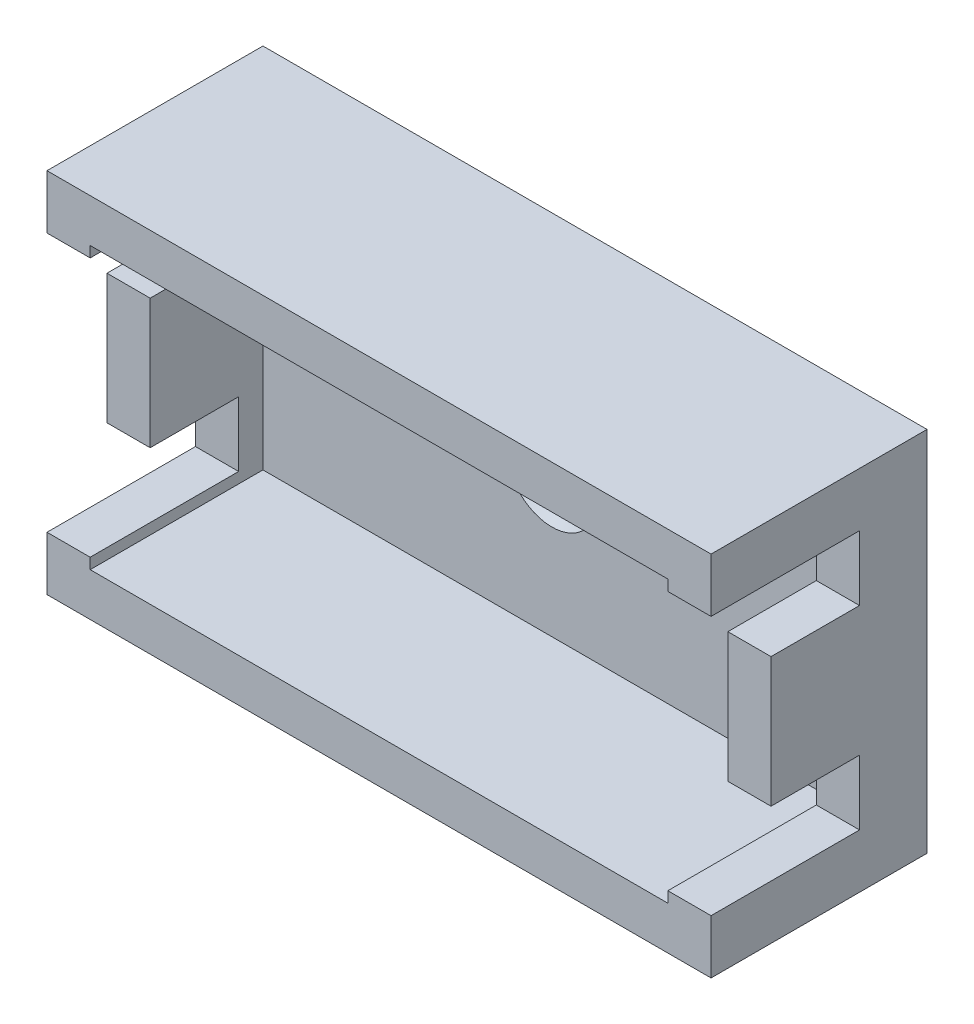
ISO-10303-21;
HEADER;
FILE_DESCRIPTION(('STEP AP214'),'2;1');
FILE_NAME('part.step','',(''),(''),'','','');
FILE_SCHEMA(('AUTOMOTIVE_DESIGN { 1 0 10303 214 1 1 1 1 }'));
ENDSEC;
DATA;
#1=APPLICATION_CONTEXT('core data for automotive mechanical design processes');
#2=APPLICATION_PROTOCOL_DEFINITION('international standard','automotive_design',2000,#1);
#3=PRODUCT_CONTEXT('',#1,'mechanical');
#4=PRODUCT('Part','Part','',(#3));
#5=PRODUCT_RELATED_PRODUCT_CATEGORY('part','',(#4));
#6=PRODUCT_DEFINITION_FORMATION('','',#4);
#7=PRODUCT_DEFINITION_CONTEXT('part definition',#1,'design');
#8=PRODUCT_DEFINITION('design','',#6,#7);
#9=PRODUCT_DEFINITION_SHAPE('','',#8);
#10=(LENGTH_UNIT() NAMED_UNIT(*) SI_UNIT(.MILLI.,.METRE.));
#11=(NAMED_UNIT(*) PLANE_ANGLE_UNIT() SI_UNIT($,.RADIAN.));
#12=(NAMED_UNIT(*) SI_UNIT($,.STERADIAN.) SOLID_ANGLE_UNIT());
#13=UNCERTAINTY_MEASURE_WITH_UNIT(LENGTH_MEASURE(1.E-05),#10,'distance_accuracy_value','');
#14=(GEOMETRIC_REPRESENTATION_CONTEXT(3) GLOBAL_UNCERTAINTY_ASSIGNED_CONTEXT((#13)) GLOBAL_UNIT_ASSIGNED_CONTEXT((#10,
#11,#12)) REPRESENTATION_CONTEXT('',''));
#15=CARTESIAN_POINT('',(0.,0.,0.));
#16=DIRECTION('',(0.,0.,1.));
#17=DIRECTION('',(1.,0.,0.));
#18=AXIS2_PLACEMENT_3D('',#15,#16,#17);
#19=CARTESIAN_POINT('',(0.,0.,20.));
#20=DIRECTION('',(0.,0.,1.));
#21=DIRECTION('',(1.,0.,0.));
#22=AXIS2_PLACEMENT_3D('',#19,#20,#21);
#23=PLANE('',#22);
#24=DIRECTION('',(0.,1.,0.));
#25=VECTOR('',#24,1.);
#26=CARTESIAN_POINT('',(4.,0.,20.));
#27=LINE('',#26,#25);
#28=CARTESIAN_POINT('',(4.,25.,20.));
#29=VERTEX_POINT('',#28);
#30=CARTESIAN_POINT('',(4.,30.,20.));
#31=VERTEX_POINT('',#30);
#32=EDGE_CURVE('E362',#29,#31,#27,.T.);
#33=ORIENTED_EDGE('',*,*,#32,.T.);
#34=DIRECTION('',(-1.,0.,0.));
#35=VECTOR('',#34,1.);
#36=CARTESIAN_POINT('',(0.,30.,20.));
#37=LINE('',#36,#35);
#38=CARTESIAN_POINT('',(-57.5,30.,20.));
#39=VERTEX_POINT('',#38);
#40=EDGE_CURVE('E224',#31,#39,#37,.T.);
#41=ORIENTED_EDGE('',*,*,#40,.T.);
#42=DIRECTION('',(0.,-1.,0.));
#43=VECTOR('',#42,1.);
#44=CARTESIAN_POINT('',(-57.5,0.,20.));
#45=LINE('',#44,#43);
#46=CARTESIAN_POINT('',(-57.5,25.,20.));
#47=VERTEX_POINT('',#46);
#48=EDGE_CURVE('E218',#39,#47,#45,.T.);
#49=ORIENTED_EDGE('',*,*,#48,.T.);
#50=DIRECTION('',(1.,0.,0.));
#51=VECTOR('',#50,1.);
#52=CARTESIAN_POINT('',(-57.5,25.,20.));
#53=LINE('',#52,#51);
#54=CARTESIAN_POINT('',(-53.5,25.,20.));
#55=VERTEX_POINT('',#54);
#56=EDGE_CURVE('E221',#47,#55,#53,.T.);
#57=ORIENTED_EDGE('',*,*,#56,.T.);
#58=DIRECTION('',(0.,-1.,0.));
#59=VECTOR('',#58,1.);
#60=CARTESIAN_POINT('',(-53.5,0.,20.));
#61=LINE('',#60,#59);
#62=CARTESIAN_POINT('',(-53.5,26.,20.));
#63=VERTEX_POINT('',#62);
#64=EDGE_CURVE('E344',#63,#55,#61,.T.);
#65=ORIENTED_EDGE('',*,*,#64,.F.);
#66=DIRECTION('',(-1.,0.,0.));
#67=VECTOR('',#66,1.);
#68=CARTESIAN_POINT('',(0.,26.,20.));
#69=LINE('',#68,#67);
#70=CARTESIAN_POINT('',(0.,26.,20.));
#71=VERTEX_POINT('',#70);
#72=EDGE_CURVE('E341',#71,#63,#69,.T.);
#73=ORIENTED_EDGE('',*,*,#72,.F.);
#74=DIRECTION('',(0.,1.,0.));
#75=VECTOR('',#74,1.);
#76=CARTESIAN_POINT('',(0.,0.,20.));
#77=LINE('',#76,#75);
#78=CARTESIAN_POINT('',(0.,25.,20.));
#79=VERTEX_POINT('',#78);
#80=EDGE_CURVE('E337',#79,#71,#77,.T.);
#81=ORIENTED_EDGE('',*,*,#80,.F.);
#82=EDGE_CURVE('E240',#79,#29,#53,.T.);
#83=ORIENTED_EDGE('',*,*,#82,.T.);
#84=EDGE_LOOP('',(#33,#41,#49,#57,#65,#73,#81,#83));
#85=FACE_BOUND('',#84,.T.);
#86=ADVANCED_FACE('F57',(#85),#23,.T.);
#87=CARTESIAN_POINT('',(4.,0.,20.));
#88=DIRECTION('',(-1.,0.,0.));
#89=DIRECTION('',(0.,0.,1.));
#90=AXIS2_PLACEMENT_3D('',#87,#88,#89);
#91=PLANE('',#90);
#92=DIRECTION('',(0.,0.,1.));
#93=VECTOR('',#92,1.);
#94=CARTESIAN_POINT('',(4.,25.,20.));
#95=LINE('',#94,#93);
#96=CARTESIAN_POINT('',(4.,25.,6.25023031285698));
#97=VERTEX_POINT('',#96);
#98=EDGE_CURVE('E320',#97,#29,#95,.T.);
#99=ORIENTED_EDGE('',*,*,#98,.F.);
#100=DIRECTION('',(0.,1.,0.));
#101=VECTOR('',#100,1.);
#102=CARTESIAN_POINT('',(4.,0.,6.25023031285698));
#103=LINE('',#102,#101);
#104=CARTESIAN_POINT('',(4.,19.,6.25023031285698));
#105=VERTEX_POINT('',#104);
#106=EDGE_CURVE('E315',#105,#97,#103,.T.);
#107=ORIENTED_EDGE('',*,*,#106,.F.);
#108=DIRECTION('',(0.,0.,-1.));
#109=VECTOR('',#108,1.);
#110=CARTESIAN_POINT('',(4.,19.,20.));
#111=LINE('',#110,#109);
#112=CARTESIAN_POINT('',(4.,19.,14.4456830158087));
#113=VERTEX_POINT('',#112);
#114=EDGE_CURVE('E310',#113,#105,#111,.T.);
#115=ORIENTED_EDGE('',*,*,#114,.F.);
#116=DIRECTION('',(0.,1.,0.));
#117=VECTOR('',#116,1.);
#118=CARTESIAN_POINT('',(4.,0.,14.4456830158087));
#119=LINE('',#118,#117);
#120=CARTESIAN_POINT('',(4.,6.99999999999998,14.4456830158087));
#121=VERTEX_POINT('',#120);
#122=EDGE_CURVE('E305',#121,#113,#119,.T.);
#123=ORIENTED_EDGE('',*,*,#122,.F.);
#124=DIRECTION('',(0.,0.,1.));
#125=VECTOR('',#124,1.);
#126=CARTESIAN_POINT('',(4.,6.99999999999998,20.));
#127=LINE('',#126,#125);
#128=CARTESIAN_POINT('',(4.,6.99999999999999,6.25023031285698));
#129=VERTEX_POINT('',#128);
#130=EDGE_CURVE('E300',#129,#121,#127,.T.);
#131=ORIENTED_EDGE('',*,*,#130,.F.);
#132=DIRECTION('',(0.,1.,0.));
#133=VECTOR('',#132,1.);
#134=CARTESIAN_POINT('',(4.,0.,6.25023031285698));
#135=LINE('',#134,#133);
#136=CARTESIAN_POINT('',(4.,0.999999999999987,6.25023031285698));
#137=VERTEX_POINT('',#136);
#138=EDGE_CURVE('E295',#137,#129,#135,.T.);
#139=ORIENTED_EDGE('',*,*,#138,.F.);
#140=DIRECTION('',(0.,0.,-1.));
#141=VECTOR('',#140,1.);
#142=CARTESIAN_POINT('',(4.,1.,20.));
#143=LINE('',#142,#141);
#144=CARTESIAN_POINT('',(4.,1.,20.));
#145=VERTEX_POINT('',#144);
#146=EDGE_CURVE('E249',#145,#137,#143,.T.);
#147=ORIENTED_EDGE('',*,*,#146,.F.);
#148=CARTESIAN_POINT('',(4.,-4.,20.));
#149=VERTEX_POINT('',#148);
#150=EDGE_CURVE('E360',#149,#145,#27,.T.);
#151=ORIENTED_EDGE('',*,*,#150,.F.);
#152=DIRECTION('',(0.,0.,-1.));
#153=VECTOR('',#152,1.);
#154=CARTESIAN_POINT('',(4.,-4.,20.));
#155=LINE('',#154,#153);
#156=CARTESIAN_POINT('',(4.,-4.,0.));
#157=VERTEX_POINT('',#156);
#158=EDGE_CURVE('E365',#149,#157,#155,.T.);
#159=ORIENTED_EDGE('',*,*,#158,.T.);
#160=DIRECTION('',(0.,1.,0.));
#161=VECTOR('',#160,1.);
#162=CARTESIAN_POINT('',(4.,0.,0.));
#163=LINE('',#162,#161);
#164=CARTESIAN_POINT('',(4.,30.,0.));
#165=VERTEX_POINT('',#164);
#166=EDGE_CURVE('E359',#157,#165,#163,.T.);
#167=ORIENTED_EDGE('',*,*,#166,.T.);
#168=DIRECTION('',(0.,0.,-1.));
#169=VECTOR('',#168,1.);
#170=CARTESIAN_POINT('',(4.,30.,20.));
#171=LINE('',#170,#169);
#172=EDGE_CURVE('E381',#31,#165,#171,.T.);
#173=ORIENTED_EDGE('',*,*,#172,.F.);
#174=ORIENTED_EDGE('',*,*,#32,.F.);
#175=EDGE_LOOP('',(#99,#107,#115,#123,#131,#139,#147,#151,#159,#167,#173,#174));
#176=FACE_BOUND('',#175,.T.);
#177=ADVANCED_FACE('F418',(#176),#91,.F.);
#178=CARTESIAN_POINT('',(-57.5,0.,20.));
#179=DIRECTION('',(1.,0.,0.));
#180=DIRECTION('',(0.,0.,-1.));
#181=AXIS2_PLACEMENT_3D('',#178,#179,#180);
#182=PLANE('',#181);
#183=DIRECTION('',(0.,0.,-1.));
#184=VECTOR('',#183,1.);
#185=CARTESIAN_POINT('',(-57.5,25.,20.));
#186=LINE('',#185,#184);
#187=CARTESIAN_POINT('',(-57.5,25.,6.25023031285698));
#188=VERTEX_POINT('',#187);
#189=EDGE_CURVE('E236',#47,#188,#186,.T.);
#190=ORIENTED_EDGE('',*,*,#189,.F.);
#191=ORIENTED_EDGE('',*,*,#48,.F.);
#192=DIRECTION('',(0.,0.,-1.));
#193=VECTOR('',#192,1.);
#194=CARTESIAN_POINT('',(-57.5,30.,20.));
#195=LINE('',#194,#193);
#196=CARTESIAN_POINT('',(-57.5,30.,0.));
#197=VERTEX_POINT('',#196);
#198=EDGE_CURVE('E379',#39,#197,#195,.T.);
#199=ORIENTED_EDGE('',*,*,#198,.T.);
#200=DIRECTION('',(0.,-1.,0.));
#201=VECTOR('',#200,1.);
#202=CARTESIAN_POINT('',(-57.5,0.,0.));
#203=LINE('',#202,#201);
#204=CARTESIAN_POINT('',(-57.5,-4.00000000000001,0.));
#205=VERTEX_POINT('',#204);
#206=EDGE_CURVE('E370',#197,#205,#203,.T.);
#207=ORIENTED_EDGE('',*,*,#206,.T.);
#208=DIRECTION('',(0.,0.,-1.));
#209=VECTOR('',#208,1.);
#210=CARTESIAN_POINT('',(-57.5,-4.00000000000001,20.));
#211=LINE('',#210,#209);
#212=CARTESIAN_POINT('',(-57.5,-4.00000000000001,20.));
#213=VERTEX_POINT('',#212);
#214=EDGE_CURVE('E376',#213,#205,#211,.T.);
#215=ORIENTED_EDGE('',*,*,#214,.F.);
#216=CARTESIAN_POINT('',(-57.5,1.,20.));
#217=VERTEX_POINT('',#216);
#218=EDGE_CURVE('E230',#217,#213,#45,.T.);
#219=ORIENTED_EDGE('',*,*,#218,.F.);
#220=DIRECTION('',(0.,0.,1.));
#221=VECTOR('',#220,1.);
#222=CARTESIAN_POINT('',(-57.5,1.,20.));
#223=LINE('',#222,#221);
#224=CARTESIAN_POINT('',(-57.5,0.999999999999987,6.25023031285698));
#225=VERTEX_POINT('',#224);
#226=EDGE_CURVE('E274',#225,#217,#223,.T.);
#227=ORIENTED_EDGE('',*,*,#226,.F.);
#228=DIRECTION('',(0.,-1.,0.));
#229=VECTOR('',#228,1.);
#230=CARTESIAN_POINT('',(-57.5,0.999999999999987,6.25023031285698));
#231=LINE('',#230,#229);
#232=CARTESIAN_POINT('',(-57.5,6.99999999999999,6.25023031285698));
#233=VERTEX_POINT('',#232);
#234=EDGE_CURVE('E269',#233,#225,#231,.T.);
#235=ORIENTED_EDGE('',*,*,#234,.F.);
#236=DIRECTION('',(0.,0.,-1.));
#237=VECTOR('',#236,1.);
#238=CARTESIAN_POINT('',(-57.5,6.99999999999998,14.4456830158087));
#239=LINE('',#238,#237);
#240=CARTESIAN_POINT('',(-57.5,6.99999999999998,14.4456830158087));
#241=VERTEX_POINT('',#240);
#242=EDGE_CURVE('E259',#241,#233,#239,.T.);
#243=ORIENTED_EDGE('',*,*,#242,.F.);
#244=DIRECTION('',(0.,-1.,0.));
#245=VECTOR('',#244,1.);
#246=CARTESIAN_POINT('',(-57.5,19.,14.4456830158087));
#247=LINE('',#246,#245);
#248=CARTESIAN_POINT('',(-57.5,19.,14.4456830158087));
#249=VERTEX_POINT('',#248);
#250=EDGE_CURVE('E254',#249,#241,#247,.T.);
#251=ORIENTED_EDGE('',*,*,#250,.F.);
#252=DIRECTION('',(0.,0.,1.));
#253=VECTOR('',#252,1.);
#254=CARTESIAN_POINT('',(-57.5,19.,14.4456830158087));
#255=LINE('',#254,#253);
#256=CARTESIAN_POINT('',(-57.5,19.,6.25023031285698));
#257=VERTEX_POINT('',#256);
#258=EDGE_CURVE('E264',#257,#249,#255,.T.);
#259=ORIENTED_EDGE('',*,*,#258,.F.);
#260=DIRECTION('',(0.,-1.,0.));
#261=VECTOR('',#260,1.);
#262=CARTESIAN_POINT('',(-57.5,25.,6.25023031285698));
#263=LINE('',#262,#261);
#264=EDGE_CURVE('E245',#188,#257,#263,.T.);
#265=ORIENTED_EDGE('',*,*,#264,.F.);
#266=EDGE_LOOP('',(#190,#191,#199,#207,#215,#219,#227,#235,#243,#251,#259,#265));
#267=FACE_BOUND('',#266,.T.);
#268=ADVANCED_FACE('F242',(#267),#182,.F.);
#269=CARTESIAN_POINT('',(0.,0.,20.));
#270=DIRECTION('',(-1.,0.,0.));
#271=DIRECTION('',(0.,0.,1.));
#272=AXIS2_PLACEMENT_3D('',#269,#270,#271);
#273=PLANE('',#272);
#274=DIRECTION('',(0.,1.,0.));
#275=VECTOR('',#274,1.);
#276=CARTESIAN_POINT('',(0.,0.,6.25023031285698));
#277=LINE('',#276,#275);
#278=CARTESIAN_POINT('',(0.,19.,6.25023031285698));
#279=VERTEX_POINT('',#278);
#280=CARTESIAN_POINT('',(0.,25.,6.25023031285698));
#281=VERTEX_POINT('',#280);
#282=EDGE_CURVE('E312',#279,#281,#277,.T.);
#283=ORIENTED_EDGE('',*,*,#282,.T.);
#284=DIRECTION('',(0.,0.,1.));
#285=VECTOR('',#284,1.);
#286=CARTESIAN_POINT('',(0.,25.,20.));
#287=LINE('',#286,#285);
#288=EDGE_CURVE('E317',#281,#79,#287,.T.);
#289=ORIENTED_EDGE('',*,*,#288,.T.);
#290=ORIENTED_EDGE('',*,*,#80,.T.);
#291=DIRECTION('',(0.,0.,-1.));
#292=VECTOR('',#291,1.);
#293=CARTESIAN_POINT('',(0.,26.,20.));
#294=LINE('',#293,#292);
#295=CARTESIAN_POINT('',(0.,26.,4.));
#296=VERTEX_POINT('',#295);
#297=EDGE_CURVE('E356',#71,#296,#294,.T.);
#298=ORIENTED_EDGE('',*,*,#297,.T.);
#299=DIRECTION('',(0.,1.,0.));
#300=VECTOR('',#299,1.);
#301=CARTESIAN_POINT('',(0.,0.,4.));
#302=LINE('',#301,#300);
#303=CARTESIAN_POINT('',(0.,0.,4.));
#304=VERTEX_POINT('',#303);
#305=EDGE_CURVE('E325',#304,#296,#302,.T.);
#306=ORIENTED_EDGE('',*,*,#305,.F.);
#307=DIRECTION('',(0.,0.,-1.));
#308=VECTOR('',#307,1.);
#309=CARTESIAN_POINT('',(0.,0.,20.));
#310=LINE('',#309,#308);
#311=CARTESIAN_POINT('',(0.,0.,20.));
#312=VERTEX_POINT('',#311);
#313=EDGE_CURVE('E348',#312,#304,#310,.T.);
#314=ORIENTED_EDGE('',*,*,#313,.F.);
#315=CARTESIAN_POINT('',(0.,1.,20.));
#316=VERTEX_POINT('',#315);
#317=EDGE_CURVE('E338',#312,#316,#77,.T.);
#318=ORIENTED_EDGE('',*,*,#317,.T.);
#319=DIRECTION('',(0.,0.,-1.));
#320=VECTOR('',#319,1.);
#321=CARTESIAN_POINT('',(0.,1.,20.));
#322=LINE('',#321,#320);
#323=CARTESIAN_POINT('',(0.,0.999999999999987,6.25023031285698));
#324=VERTEX_POINT('',#323);
#325=EDGE_CURVE('E246',#316,#324,#322,.T.);
#326=ORIENTED_EDGE('',*,*,#325,.T.);
#327=DIRECTION('',(0.,1.,0.));
#328=VECTOR('',#327,1.);
#329=CARTESIAN_POINT('',(0.,0.,6.25023031285698));
#330=LINE('',#329,#328);
#331=CARTESIAN_POINT('',(0.,6.99999999999999,6.25023031285698));
#332=VERTEX_POINT('',#331);
#333=EDGE_CURVE('E292',#324,#332,#330,.T.);
#334=ORIENTED_EDGE('',*,*,#333,.T.);
#335=DIRECTION('',(0.,0.,1.));
#336=VECTOR('',#335,1.);
#337=CARTESIAN_POINT('',(0.,6.99999999999998,20.));
#338=LINE('',#337,#336);
#339=CARTESIAN_POINT('',(0.,6.99999999999998,14.4456830158087));
#340=VERTEX_POINT('',#339);
#341=EDGE_CURVE('E297',#332,#340,#338,.T.);
#342=ORIENTED_EDGE('',*,*,#341,.T.);
#343=DIRECTION('',(0.,1.,0.));
#344=VECTOR('',#343,1.);
#345=CARTESIAN_POINT('',(0.,0.,14.4456830158087));
#346=LINE('',#345,#344);
#347=CARTESIAN_POINT('',(0.,19.,14.4456830158087));
#348=VERTEX_POINT('',#347);
#349=EDGE_CURVE('E302',#340,#348,#346,.T.);
#350=ORIENTED_EDGE('',*,*,#349,.T.);
#351=DIRECTION('',(0.,0.,-1.));
#352=VECTOR('',#351,1.);
#353=CARTESIAN_POINT('',(0.,19.,20.));
#354=LINE('',#353,#352);
#355=EDGE_CURVE('E307',#348,#279,#354,.T.);
#356=ORIENTED_EDGE('',*,*,#355,.T.);
#357=EDGE_LOOP('',(#283,#289,#290,#298,#306,#314,#318,#326,#334,#342,#350,#356));
#358=FACE_BOUND('',#357,.T.);
#359=ADVANCED_FACE('F437',(#358),#273,.T.);
#360=CARTESIAN_POINT('',(-53.5,0.,20.));
#361=DIRECTION('',(1.,0.,0.));
#362=DIRECTION('',(0.,0.,-1.));
#363=AXIS2_PLACEMENT_3D('',#360,#361,#362);
#364=PLANE('',#363);
#365=ORIENTED_EDGE('',*,*,#64,.T.);
#366=DIRECTION('',(0.,0.,-1.));
#367=VECTOR('',#366,1.);
#368=CARTESIAN_POINT('',(-53.5,25.,20.));
#369=LINE('',#368,#367);
#370=CARTESIAN_POINT('',(-53.5,25.,6.25023031285698));
#371=VERTEX_POINT('',#370);
#372=EDGE_CURVE('E239',#55,#371,#369,.T.);
#373=ORIENTED_EDGE('',*,*,#372,.T.);
#374=DIRECTION('',(0.,-1.,0.));
#375=VECTOR('',#374,1.);
#376=CARTESIAN_POINT('',(-53.5,0.,6.25023031285698));
#377=LINE('',#376,#375);
#378=CARTESIAN_POINT('',(-53.5,19.,6.25023031285698));
#379=VERTEX_POINT('',#378);
#380=EDGE_CURVE('E398',#371,#379,#377,.T.);
#381=ORIENTED_EDGE('',*,*,#380,.T.);
#382=DIRECTION('',(0.,0.,1.));
#383=VECTOR('',#382,1.);
#384=CARTESIAN_POINT('',(-53.5,19.,20.));
#385=LINE('',#384,#383);
#386=CARTESIAN_POINT('',(-53.5,19.,14.4456830158087));
#387=VERTEX_POINT('',#386);
#388=EDGE_CURVE('E395',#379,#387,#385,.T.);
#389=ORIENTED_EDGE('',*,*,#388,.T.);
#390=DIRECTION('',(0.,-1.,0.));
#391=VECTOR('',#390,1.);
#392=CARTESIAN_POINT('',(-53.5,0.,14.4456830158087));
#393=LINE('',#392,#391);
#394=CARTESIAN_POINT('',(-53.5,6.99999999999998,14.4456830158087));
#395=VERTEX_POINT('',#394);
#396=EDGE_CURVE('E392',#387,#395,#393,.T.);
#397=ORIENTED_EDGE('',*,*,#396,.T.);
#398=DIRECTION('',(0.,0.,-1.));
#399=VECTOR('',#398,1.);
#400=CARTESIAN_POINT('',(-53.5,6.99999999999998,20.));
#401=LINE('',#400,#399);
#402=CARTESIAN_POINT('',(-53.5,6.99999999999999,6.25023031285698));
#403=VERTEX_POINT('',#402);
#404=EDGE_CURVE('E389',#395,#403,#401,.T.);
#405=ORIENTED_EDGE('',*,*,#404,.T.);
#406=DIRECTION('',(0.,-1.,0.));
#407=VECTOR('',#406,1.);
#408=CARTESIAN_POINT('',(-53.5,0.,6.25023031285698));
#409=LINE('',#408,#407);
#410=CARTESIAN_POINT('',(-53.5,0.999999999999987,6.25023031285698));
#411=VERTEX_POINT('',#410);
#412=EDGE_CURVE('E386',#403,#411,#409,.T.);
#413=ORIENTED_EDGE('',*,*,#412,.T.);
#414=DIRECTION('',(0.,0.,1.));
#415=VECTOR('',#414,1.);
#416=CARTESIAN_POINT('',(-53.5,1.,20.));
#417=LINE('',#416,#415);
#418=CARTESIAN_POINT('',(-53.5,1.,20.));
#419=VERTEX_POINT('',#418);
#420=EDGE_CURVE('E384',#411,#419,#417,.T.);
#421=ORIENTED_EDGE('',*,*,#420,.T.);
#422=CARTESIAN_POINT('',(-53.5,0.,20.));
#423=VERTEX_POINT('',#422);
#424=EDGE_CURVE('E343',#419,#423,#61,.T.);
#425=ORIENTED_EDGE('',*,*,#424,.T.);
#426=DIRECTION('',(0.,0.,-1.));
#427=VECTOR('',#426,1.);
#428=CARTESIAN_POINT('',(-53.5,0.,20.));
#429=LINE('',#428,#427);
#430=CARTESIAN_POINT('',(-53.5,0.,4.));
#431=VERTEX_POINT('',#430);
#432=EDGE_CURVE('E350',#423,#431,#429,.T.);
#433=ORIENTED_EDGE('',*,*,#432,.T.);
#434=DIRECTION('',(0.,-1.,0.));
#435=VECTOR('',#434,1.);
#436=CARTESIAN_POINT('',(-53.5,0.,4.));
#437=LINE('',#436,#435);
#438=CARTESIAN_POINT('',(-53.5,26.,4.));
#439=VERTEX_POINT('',#438);
#440=EDGE_CURVE('E331',#439,#431,#437,.T.);
#441=ORIENTED_EDGE('',*,*,#440,.F.);
#442=DIRECTION('',(0.,0.,-1.));
#443=VECTOR('',#442,1.);
#444=CARTESIAN_POINT('',(-53.5,26.,20.));
#445=LINE('',#444,#443);
#446=EDGE_CURVE('E353',#63,#439,#445,.T.);
#447=ORIENTED_EDGE('',*,*,#446,.F.);
#448=EDGE_LOOP('',(#365,#373,#381,#389,#397,#405,#413,#421,#425,#433,#441,#447));
#449=FACE_BOUND('',#448,.T.);
#450=ADVANCED_FACE('F429',(#449),#364,.T.);
#451=ORIENTED_EDGE('',*,*,#150,.T.);
#452=DIRECTION('',(1.,0.,0.));
#453=VECTOR('',#452,1.);
#454=CARTESIAN_POINT('',(-57.5,1.,20.));
#455=LINE('',#454,#453);
#456=EDGE_CURVE('E279',#316,#145,#455,.T.);
#457=ORIENTED_EDGE('',*,*,#456,.F.);
#458=ORIENTED_EDGE('',*,*,#317,.F.);
#459=DIRECTION('',(1.,0.,0.));
#460=VECTOR('',#459,1.);
#461=CARTESIAN_POINT('',(0.,0.,20.));
#462=LINE('',#461,#460);
#463=EDGE_CURVE('E346',#423,#312,#462,.T.);
#464=ORIENTED_EDGE('',*,*,#463,.F.);
#465=ORIENTED_EDGE('',*,*,#424,.F.);
#466=EDGE_CURVE('E80',#217,#419,#455,.T.);
#467=ORIENTED_EDGE('',*,*,#466,.F.);
#468=ORIENTED_EDGE('',*,*,#218,.T.);
#469=DIRECTION('',(1.,0.,0.));
#470=VECTOR('',#469,1.);
#471=CARTESIAN_POINT('',(0.,-4.,20.));
#472=LINE('',#471,#470);
#473=EDGE_CURVE('E229',#213,#149,#472,.T.);
#474=ORIENTED_EDGE('',*,*,#473,.T.);
#475=EDGE_LOOP('',(#451,#457,#458,#464,#465,#467,#468,#474));
#476=FACE_BOUND('',#475,.T.);
#477=ADVANCED_FACE('F420',(#476),#23,.T.);
#478=CARTESIAN_POINT('',(0.,0.,0.));
#479=DIRECTION('',(0.,0.,1.));
#480=DIRECTION('',(1.,0.,0.));
#481=AXIS2_PLACEMENT_3D('',#478,#479,#480);
#482=PLANE('',#481);
#483=CARTESIAN_POINT('',(-26.75,13.,0.));
#484=DIRECTION('',(0.,0.,1.));
#485=DIRECTION('',(1.,0.,0.));
#486=AXIS2_PLACEMENT_3D('',#483,#484,#485);
#487=CIRCLE('',#486,2.00000000000001);
#488=CARTESIAN_POINT('',(-24.75,13.,0.));
#489=VERTEX_POINT('',#488);
#490=EDGE_CURVE('E322',#489,#489,#487,.T.);
#491=ORIENTED_EDGE('',*,*,#490,.T.);
#492=EDGE_LOOP('',(#491));
#493=FACE_BOUND('',#492,.T.);
#494=ORIENTED_EDGE('',*,*,#166,.F.);
#495=DIRECTION('',(1.,0.,0.));
#496=VECTOR('',#495,1.);
#497=CARTESIAN_POINT('',(0.,-4.,0.));
#498=LINE('',#497,#496);
#499=EDGE_CURVE('E372',#205,#157,#498,.T.);
#500=ORIENTED_EDGE('',*,*,#499,.F.);
#501=ORIENTED_EDGE('',*,*,#206,.F.);
#502=DIRECTION('',(-1.,0.,0.));
#503=VECTOR('',#502,1.);
#504=CARTESIAN_POINT('',(0.,30.,0.));
#505=LINE('',#504,#503);
#506=EDGE_CURVE('E368',#165,#197,#505,.T.);
#507=ORIENTED_EDGE('',*,*,#506,.F.);
#508=EDGE_LOOP('',(#494,#500,#501,#507));
#509=FACE_BOUND('',#508,.T.);
#510=ADVANCED_FACE('F428',(#493,#509),#482,.F.);
#511=CARTESIAN_POINT('',(0.,30.,20.));
#512=DIRECTION('',(0.,-1.,0.));
#513=DIRECTION('',(1.,0.,0.));
#514=AXIS2_PLACEMENT_3D('',#511,#512,#513);
#515=PLANE('',#514);
#516=ORIENTED_EDGE('',*,*,#506,.T.);
#517=ORIENTED_EDGE('',*,*,#198,.F.);
#518=ORIENTED_EDGE('',*,*,#40,.F.);
#519=ORIENTED_EDGE('',*,*,#172,.T.);
#520=EDGE_LOOP('',(#516,#517,#518,#519));
#521=FACE_BOUND('',#520,.T.);
#522=ADVANCED_FACE('F435',(#521),#515,.F.);
#523=CARTESIAN_POINT('',(0.,-4.,20.));
#524=DIRECTION('',(0.,1.,0.));
#525=DIRECTION('',(-1.,0.,0.));
#526=AXIS2_PLACEMENT_3D('',#523,#524,#525);
#527=PLANE('',#526);
#528=ORIENTED_EDGE('',*,*,#499,.T.);
#529=ORIENTED_EDGE('',*,*,#158,.F.);
#530=ORIENTED_EDGE('',*,*,#473,.F.);
#531=ORIENTED_EDGE('',*,*,#214,.T.);
#532=EDGE_LOOP('',(#528,#529,#530,#531));
#533=FACE_BOUND('',#532,.T.);
#534=ADVANCED_FACE('F495',(#533),#527,.F.);
#535=CARTESIAN_POINT('',(0.,26.,20.));
#536=DIRECTION('',(0.,-1.,0.));
#537=DIRECTION('',(1.,0.,0.));
#538=AXIS2_PLACEMENT_3D('',#535,#536,#537);
#539=PLANE('',#538);
#540=DIRECTION('',(-1.,0.,0.));
#541=VECTOR('',#540,1.);
#542=CARTESIAN_POINT('',(0.,26.,4.));
#543=LINE('',#542,#541);
#544=EDGE_CURVE('E328',#296,#439,#543,.T.);
#545=ORIENTED_EDGE('',*,*,#544,.F.);
#546=ORIENTED_EDGE('',*,*,#297,.F.);
#547=ORIENTED_EDGE('',*,*,#72,.T.);
#548=ORIENTED_EDGE('',*,*,#446,.T.);
#549=EDGE_LOOP('',(#545,#546,#547,#548));
#550=FACE_BOUND('',#549,.T.);
#551=ADVANCED_FACE('F471',(#550),#539,.T.);
#552=CARTESIAN_POINT('',(0.,0.,20.));
#553=DIRECTION('',(0.,1.,0.));
#554=DIRECTION('',(-1.,0.,0.));
#555=AXIS2_PLACEMENT_3D('',#552,#553,#554);
#556=PLANE('',#555);
#557=DIRECTION('',(1.,0.,0.));
#558=VECTOR('',#557,1.);
#559=CARTESIAN_POINT('',(0.,0.,4.));
#560=LINE('',#559,#558);
#561=EDGE_CURVE('E334',#431,#304,#560,.T.);
#562=ORIENTED_EDGE('',*,*,#561,.F.);
#563=ORIENTED_EDGE('',*,*,#432,.F.);
#564=ORIENTED_EDGE('',*,*,#463,.T.);
#565=ORIENTED_EDGE('',*,*,#313,.T.);
#566=EDGE_LOOP('',(#562,#563,#564,#565));
#567=FACE_BOUND('',#566,.T.);
#568=ADVANCED_FACE('F465',(#567),#556,.T.);
#569=CARTESIAN_POINT('',(0.,0.,4.));
#570=DIRECTION('',(0.,0.,1.));
#571=DIRECTION('',(1.,0.,0.));
#572=AXIS2_PLACEMENT_3D('',#569,#570,#571);
#573=PLANE('',#572);
#574=CARTESIAN_POINT('',(-26.75,13.,4.));
#575=DIRECTION('',(0.,0.,1.));
#576=DIRECTION('',(1.,0.,0.));
#577=AXIS2_PLACEMENT_3D('',#574,#575,#576);
#578=CIRCLE('',#577,4.20000000000002);
#579=CARTESIAN_POINT('',(-22.55,13.,4.));
#580=VERTEX_POINT('',#579);
#581=EDGE_CURVE('E12',#580,#580,#578,.F.);
#582=ORIENTED_EDGE('',*,*,#581,.T.);
#583=EDGE_LOOP('',(#582));
#584=FACE_BOUND('',#583,.T.);
#585=ORIENTED_EDGE('',*,*,#305,.T.);
#586=ORIENTED_EDGE('',*,*,#544,.T.);
#587=ORIENTED_EDGE('',*,*,#440,.T.);
#588=ORIENTED_EDGE('',*,*,#561,.T.);
#589=EDGE_LOOP('',(#585,#586,#587,#588));
#590=FACE_BOUND('',#589,.T.);
#591=ADVANCED_FACE('F468',(#584,#590),#573,.T.);
#592=CARTESIAN_POINT('',(-26.75,13.,0.));
#593=DIRECTION('',(0.,0.,1.));
#594=DIRECTION('',(1.,0.,0.));
#595=AXIS2_PLACEMENT_3D('',#592,#593,#594);
#596=CYLINDRICAL_SURFACE('',#595,2.00000000000001);
#597=CARTESIAN_POINT('',(-26.75,13.,1.79999999999999));
#598=DIRECTION('',(0.,0.,1.));
#599=DIRECTION('',(1.,0.,0.));
#600=AXIS2_PLACEMENT_3D('',#597,#598,#599);
#601=CIRCLE('',#600,2.00000000000001);
#602=CARTESIAN_POINT('',(-24.75,13.,1.79999999999999));
#603=VERTEX_POINT('',#602);
#604=EDGE_CURVE('E65',#603,#603,#601,.T.);
#605=ORIENTED_EDGE('',*,*,#604,.T.);
#606=EDGE_LOOP('',(#605));
#607=FACE_BOUND('',#606,.T.);
#608=ORIENTED_EDGE('',*,*,#490,.F.);
#609=EDGE_LOOP('',(#608));
#610=FACE_BOUND('',#609,.T.);
#611=ADVANCED_FACE('F404',(#607,#610),#596,.F.);
#612=CARTESIAN_POINT('',(-57.5,1.,20.));
#613=DIRECTION('',(0.,1.,0.));
#614=DIRECTION('',(0.,0.,1.));
#615=AXIS2_PLACEMENT_3D('',#612,#613,#614);
#616=PLANE('',#615);
#617=ORIENTED_EDGE('',*,*,#420,.F.);
#618=DIRECTION('',(1.,0.,0.));
#619=VECTOR('',#618,1.);
#620=CARTESIAN_POINT('',(-57.5,0.999999999999987,6.25023031285698));
#621=LINE('',#620,#619);
#622=EDGE_CURVE('E277',#225,#411,#621,.T.);
#623=ORIENTED_EDGE('',*,*,#622,.F.);
#624=ORIENTED_EDGE('',*,*,#226,.T.);
#625=ORIENTED_EDGE('',*,*,#466,.T.);
#626=EDGE_LOOP('',(#617,#623,#624,#625));
#627=FACE_BOUND('',#626,.T.);
#628=ADVANCED_FACE('F415',(#627),#616,.T.);
#629=CARTESIAN_POINT('',(-57.5,0.999999999999987,6.25023031285698));
#630=DIRECTION('',(0.,0.,1.));
#631=DIRECTION('',(0.,-1.,0.));
#632=AXIS2_PLACEMENT_3D('',#629,#630,#631);
#633=PLANE('',#632);
#634=ORIENTED_EDGE('',*,*,#412,.F.);
#635=DIRECTION('',(1.,0.,0.));
#636=VECTOR('',#635,1.);
#637=CARTESIAN_POINT('',(-57.5,6.99999999999999,6.25023031285698));
#638=LINE('',#637,#636);
#639=EDGE_CURVE('E273',#233,#403,#638,.T.);
#640=ORIENTED_EDGE('',*,*,#639,.F.);
#641=ORIENTED_EDGE('',*,*,#234,.T.);
#642=ORIENTED_EDGE('',*,*,#622,.T.);
#643=EDGE_LOOP('',(#634,#640,#641,#642));
#644=FACE_BOUND('',#643,.T.);
#645=ADVANCED_FACE('F488',(#644),#633,.T.);
#646=CARTESIAN_POINT('',(-57.5,6.99999999999998,14.4456830158087));
#647=DIRECTION('',(0.,-1.,0.));
#648=DIRECTION('',(0.,0.,-1.));
#649=AXIS2_PLACEMENT_3D('',#646,#647,#648);
#650=PLANE('',#649);
#651=ORIENTED_EDGE('',*,*,#404,.F.);
#652=DIRECTION('',(1.,0.,0.));
#653=VECTOR('',#652,1.);
#654=CARTESIAN_POINT('',(-57.5,6.99999999999998,14.4456830158087));
#655=LINE('',#654,#653);
#656=EDGE_CURVE('E263',#241,#395,#655,.T.);
#657=ORIENTED_EDGE('',*,*,#656,.F.);
#658=ORIENTED_EDGE('',*,*,#242,.T.);
#659=ORIENTED_EDGE('',*,*,#639,.T.);
#660=EDGE_LOOP('',(#651,#657,#658,#659));
#661=FACE_BOUND('',#660,.T.);
#662=ADVANCED_FACE('F485',(#661),#650,.T.);
#663=CARTESIAN_POINT('',(-57.5,19.,14.4456830158087));
#664=DIRECTION('',(0.,0.,1.));
#665=DIRECTION('',(0.,-1.,0.));
#666=AXIS2_PLACEMENT_3D('',#663,#664,#665);
#667=PLANE('',#666);
#668=ORIENTED_EDGE('',*,*,#396,.F.);
#669=DIRECTION('',(1.,0.,0.));
#670=VECTOR('',#669,1.);
#671=CARTESIAN_POINT('',(-57.5,19.,14.4456830158087));
#672=LINE('',#671,#670);
#673=EDGE_CURVE('E258',#249,#387,#672,.T.);
#674=ORIENTED_EDGE('',*,*,#673,.F.);
#675=ORIENTED_EDGE('',*,*,#250,.T.);
#676=ORIENTED_EDGE('',*,*,#656,.T.);
#677=EDGE_LOOP('',(#668,#674,#675,#676));
#678=FACE_BOUND('',#677,.T.);
#679=ADVANCED_FACE('F482',(#678),#667,.T.);
#680=CARTESIAN_POINT('',(-57.5,19.,14.4456830158087));
#681=DIRECTION('',(0.,1.,0.));
#682=DIRECTION('',(0.,0.,1.));
#683=AXIS2_PLACEMENT_3D('',#680,#681,#682);
#684=PLANE('',#683);
#685=ORIENTED_EDGE('',*,*,#388,.F.);
#686=DIRECTION('',(1.,0.,0.));
#687=VECTOR('',#686,1.);
#688=CARTESIAN_POINT('',(-57.5,19.,6.25023031285698));
#689=LINE('',#688,#687);
#690=EDGE_CURVE('E268',#257,#379,#689,.T.);
#691=ORIENTED_EDGE('',*,*,#690,.F.);
#692=ORIENTED_EDGE('',*,*,#258,.T.);
#693=ORIENTED_EDGE('',*,*,#673,.T.);
#694=EDGE_LOOP('',(#685,#691,#692,#693));
#695=FACE_BOUND('',#694,.T.);
#696=ADVANCED_FACE('F479',(#695),#684,.T.);
#697=CARTESIAN_POINT('',(-57.5,25.,6.25023031285698));
#698=DIRECTION('',(0.,0.,1.));
#699=DIRECTION('',(0.,-1.,0.));
#700=AXIS2_PLACEMENT_3D('',#697,#698,#699);
#701=PLANE('',#700);
#702=ORIENTED_EDGE('',*,*,#380,.F.);
#703=DIRECTION('',(1.,0.,0.));
#704=VECTOR('',#703,1.);
#705=CARTESIAN_POINT('',(-57.5,25.,6.25023031285698));
#706=LINE('',#705,#704);
#707=EDGE_CURVE('E253',#188,#371,#706,.T.);
#708=ORIENTED_EDGE('',*,*,#707,.F.);
#709=ORIENTED_EDGE('',*,*,#264,.T.);
#710=ORIENTED_EDGE('',*,*,#690,.T.);
#711=EDGE_LOOP('',(#702,#708,#709,#710));
#712=FACE_BOUND('',#711,.T.);
#713=ADVANCED_FACE('F477',(#712),#701,.T.);
#714=CARTESIAN_POINT('',(-57.5,25.,20.));
#715=DIRECTION('',(0.,-1.,0.));
#716=DIRECTION('',(0.,0.,-1.));
#717=AXIS2_PLACEMENT_3D('',#714,#715,#716);
#718=PLANE('',#717);
#719=ORIENTED_EDGE('',*,*,#372,.F.);
#720=ORIENTED_EDGE('',*,*,#56,.F.);
#721=ORIENTED_EDGE('',*,*,#189,.T.);
#722=ORIENTED_EDGE('',*,*,#707,.T.);
#723=EDGE_LOOP('',(#719,#720,#721,#722));
#724=FACE_BOUND('',#723,.T.);
#725=ADVANCED_FACE('F234',(#724),#718,.T.);
#726=EDGE_CURVE('E267',#281,#97,#706,.T.);
#727=ORIENTED_EDGE('',*,*,#726,.T.);
#728=ORIENTED_EDGE('',*,*,#98,.T.);
#729=ORIENTED_EDGE('',*,*,#82,.F.);
#730=ORIENTED_EDGE('',*,*,#288,.F.);
#731=EDGE_LOOP('',(#727,#728,#729,#730));
#732=FACE_BOUND('',#731,.T.);
#733=ADVANCED_FACE('F504',(#732),#718,.T.);
#734=EDGE_CURVE('E257',#279,#105,#689,.T.);
#735=ORIENTED_EDGE('',*,*,#734,.T.);
#736=ORIENTED_EDGE('',*,*,#106,.T.);
#737=ORIENTED_EDGE('',*,*,#726,.F.);
#738=ORIENTED_EDGE('',*,*,#282,.F.);
#739=EDGE_LOOP('',(#735,#736,#737,#738));
#740=FACE_BOUND('',#739,.T.);
#741=ADVANCED_FACE('F508',(#740),#701,.T.);
#742=EDGE_CURVE('E262',#348,#113,#672,.T.);
#743=ORIENTED_EDGE('',*,*,#742,.T.);
#744=ORIENTED_EDGE('',*,*,#114,.T.);
#745=ORIENTED_EDGE('',*,*,#734,.F.);
#746=ORIENTED_EDGE('',*,*,#355,.F.);
#747=EDGE_LOOP('',(#743,#744,#745,#746));
#748=FACE_BOUND('',#747,.T.);
#749=ADVANCED_FACE('F513',(#748),#684,.T.);
#750=EDGE_CURVE('E272',#340,#121,#655,.T.);
#751=ORIENTED_EDGE('',*,*,#750,.T.);
#752=ORIENTED_EDGE('',*,*,#122,.T.);
#753=ORIENTED_EDGE('',*,*,#742,.F.);
#754=ORIENTED_EDGE('',*,*,#349,.F.);
#755=EDGE_LOOP('',(#751,#752,#753,#754));
#756=FACE_BOUND('',#755,.T.);
#757=ADVANCED_FACE('F515',(#756),#667,.T.);
#758=EDGE_CURVE('E276',#332,#129,#638,.T.);
#759=ORIENTED_EDGE('',*,*,#758,.T.);
#760=ORIENTED_EDGE('',*,*,#130,.T.);
#761=ORIENTED_EDGE('',*,*,#750,.F.);
#762=ORIENTED_EDGE('',*,*,#341,.F.);
#763=EDGE_LOOP('',(#759,#760,#761,#762));
#764=FACE_BOUND('',#763,.T.);
#765=ADVANCED_FACE('F455',(#764),#650,.T.);
#766=EDGE_CURVE('E72',#324,#137,#621,.T.);
#767=ORIENTED_EDGE('',*,*,#766,.T.);
#768=ORIENTED_EDGE('',*,*,#138,.T.);
#769=ORIENTED_EDGE('',*,*,#758,.F.);
#770=ORIENTED_EDGE('',*,*,#333,.F.);
#771=EDGE_LOOP('',(#767,#768,#769,#770));
#772=FACE_BOUND('',#771,.T.);
#773=ADVANCED_FACE('F413',(#772),#633,.T.);
#774=ORIENTED_EDGE('',*,*,#456,.T.);
#775=ORIENTED_EDGE('',*,*,#146,.T.);
#776=ORIENTED_EDGE('',*,*,#766,.F.);
#777=ORIENTED_EDGE('',*,*,#325,.F.);
#778=EDGE_LOOP('',(#774,#775,#776,#777));
#779=FACE_BOUND('',#778,.T.);
#780=ADVANCED_FACE('F408',(#779),#616,.T.);
#781=CARTESIAN_POINT('',(-26.75,13.,1.79999999999999));
#782=DIRECTION('',(0.,0.,1.));
#783=DIRECTION('',(1.,0.,0.));
#784=AXIS2_PLACEMENT_3D('',#781,#782,#783);
#785=CONICAL_SURFACE('',#784,2.00000000000001,0.785398163397449);
#786=ORIENTED_EDGE('',*,*,#581,.F.);
#787=EDGE_LOOP('',(#786));
#788=FACE_BOUND('',#787,.T.);
#789=ORIENTED_EDGE('',*,*,#604,.F.);
#790=EDGE_LOOP('',(#789));
#791=FACE_BOUND('',#790,.T.);
#792=ADVANCED_FACE('F59',(#788,#791),#785,.F.);
#793=CLOSED_SHELL('',(#86,#177,#268,#359,#450,#477,#510,#522,#534,#551,#568,#591,#611,#628,#645,
#662,#679,#696,#713,#725,#733,#741,#749,#757,#765,#773,#780,#792));
#794=MANIFOLD_SOLID_BREP('B2',#793);
#795=ADVANCED_BREP_SHAPE_REPRESENTATION('',(#18,#794),#14);
#796=SHAPE_DEFINITION_REPRESENTATION(#9,#795);
ENDSEC;
END-ISO-10303-21;
